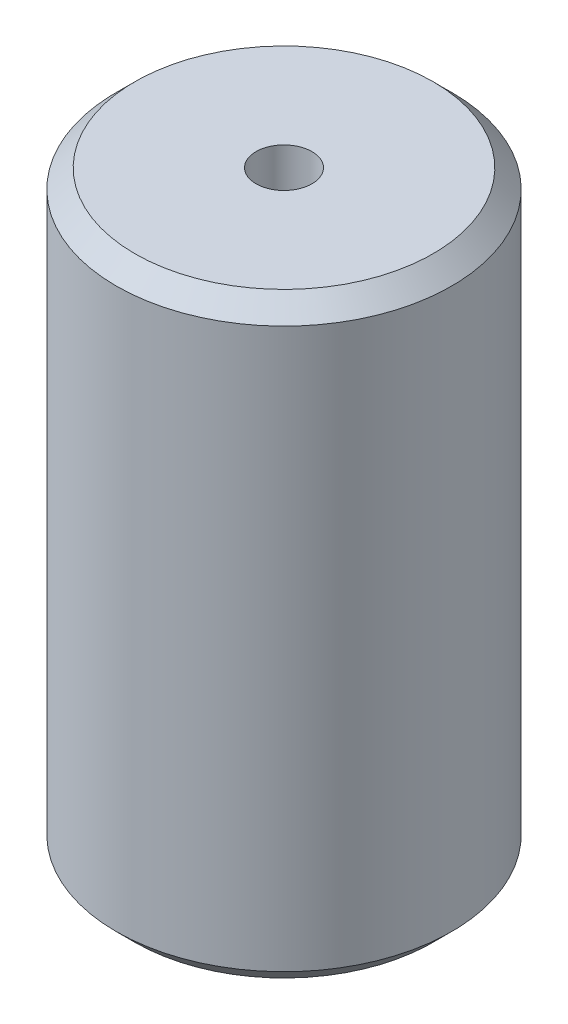
ISO-10303-21;
HEADER;
FILE_DESCRIPTION(('STEP AP214'),'2;1');
FILE_NAME('part.step','',(''),(''),'','','');
FILE_SCHEMA(('AUTOMOTIVE_DESIGN { 1 0 10303 214 1 1 1 1 }'));
ENDSEC;
DATA;
#1=APPLICATION_CONTEXT('core data for automotive mechanical design processes');
#2=APPLICATION_PROTOCOL_DEFINITION('international standard','automotive_design',2000,#1);
#3=PRODUCT_CONTEXT('',#1,'mechanical');
#4=PRODUCT('Part','Part','',(#3));
#5=PRODUCT_RELATED_PRODUCT_CATEGORY('part','',(#4));
#6=PRODUCT_DEFINITION_FORMATION('','',#4);
#7=PRODUCT_DEFINITION_CONTEXT('part definition',#1,'design');
#8=PRODUCT_DEFINITION('design','',#6,#7);
#9=PRODUCT_DEFINITION_SHAPE('','',#8);
#10=(LENGTH_UNIT() NAMED_UNIT(*) SI_UNIT(.MILLI.,.METRE.));
#11=(NAMED_UNIT(*) PLANE_ANGLE_UNIT() SI_UNIT($,.RADIAN.));
#12=(NAMED_UNIT(*) SI_UNIT($,.STERADIAN.) SOLID_ANGLE_UNIT());
#13=UNCERTAINTY_MEASURE_WITH_UNIT(LENGTH_MEASURE(1.E-05),#10,'distance_accuracy_value','');
#14=(GEOMETRIC_REPRESENTATION_CONTEXT(3) GLOBAL_UNCERTAINTY_ASSIGNED_CONTEXT((#13)) GLOBAL_UNIT_ASSIGNED_CONTEXT((#10,
#11,#12)) REPRESENTATION_CONTEXT('',''));
#15=CARTESIAN_POINT('',(0.,0.,0.));
#16=DIRECTION('',(0.,0.,1.));
#17=DIRECTION('',(1.,0.,0.));
#18=AXIS2_PLACEMENT_3D('',#15,#16,#17);
#19=CARTESIAN_POINT('',(0.,32.,0.));
#20=DIRECTION('',(0.,1.,0.));
#21=DIRECTION('',(0.,0.,1.));
#22=AXIS2_PLACEMENT_3D('',#19,#20,#21);
#23=PLANE('',#22);
#24=CARTESIAN_POINT('',(0.,32.,0.));
#25=DIRECTION('',(0.,1.,0.));
#26=DIRECTION('',(0.,0.,1.));
#27=AXIS2_PLACEMENT_3D('',#24,#25,#26);
#28=CIRCLE('',#27,8.);
#29=CARTESIAN_POINT('',(0.,32.,8.));
#30=VERTEX_POINT('',#29);
#31=EDGE_CURVE('E10',#30,#30,#28,.T.);
#32=ORIENTED_EDGE('',*,*,#31,.T.);
#33=EDGE_LOOP('',(#32));
#34=FACE_BOUND('',#33,.T.);
#35=CARTESIAN_POINT('',(0.,32.,0.));
#36=DIRECTION('',(0.,1.,0.));
#37=DIRECTION('',(0.,0.,1.));
#38=AXIS2_PLACEMENT_3D('',#35,#36,#37);
#39=CIRCLE('',#38,1.5);
#40=CARTESIAN_POINT('',(0.,32.,1.5));
#41=VERTEX_POINT('',#40);
#42=EDGE_CURVE('E72',#41,#41,#39,.T.);
#43=ORIENTED_EDGE('',*,*,#42,.F.);
#44=EDGE_LOOP('',(#43));
#45=FACE_BOUND('',#44,.T.);
#46=ADVANCED_FACE('F47',(#34,#45),#23,.T.);
#47=CARTESIAN_POINT('',(0.,0.,0.));
#48=DIRECTION('',(0.,1.,0.));
#49=DIRECTION('',(0.,0.,1.));
#50=AXIS2_PLACEMENT_3D('',#47,#48,#49);
#51=PLANE('',#50);
#52=CARTESIAN_POINT('',(0.,0.,0.));
#53=DIRECTION('',(0.,1.,0.));
#54=DIRECTION('',(0.,0.,1.));
#55=AXIS2_PLACEMENT_3D('',#52,#53,#54);
#56=CIRCLE('',#55,8.);
#57=CARTESIAN_POINT('',(0.,0.,8.));
#58=VERTEX_POINT('',#57);
#59=EDGE_CURVE('E56',#58,#58,#56,.F.);
#60=ORIENTED_EDGE('',*,*,#59,.T.);
#61=EDGE_LOOP('',(#60));
#62=FACE_BOUND('',#61,.T.);
#63=CARTESIAN_POINT('',(0.,0.,0.));
#64=DIRECTION('',(0.,1.,0.));
#65=DIRECTION('',(0.,0.,1.));
#66=AXIS2_PLACEMENT_3D('',#63,#64,#65);
#67=CIRCLE('',#66,1.5);
#68=CARTESIAN_POINT('',(0.,0.,1.5));
#69=VERTEX_POINT('',#68);
#70=EDGE_CURVE('E73',#69,#69,#67,.T.);
#71=ORIENTED_EDGE('',*,*,#70,.T.);
#72=EDGE_LOOP('',(#71));
#73=FACE_BOUND('',#72,.T.);
#74=ADVANCED_FACE('F85',(#62,#73),#51,.F.);
#75=CARTESIAN_POINT('',(0.,32.,0.));
#76=DIRECTION('',(0.,-1.,0.));
#77=DIRECTION('',(0.,0.,-1.));
#78=AXIS2_PLACEMENT_3D('',#75,#76,#77);
#79=CYLINDRICAL_SURFACE('',#78,9.);
#80=CARTESIAN_POINT('',(0.,0.999999999999994,0.));
#81=DIRECTION('',(0.,1.,0.));
#82=DIRECTION('',(0.,0.,1.));
#83=AXIS2_PLACEMENT_3D('',#80,#81,#82);
#84=CIRCLE('',#83,9.);
#85=CARTESIAN_POINT('',(0.,0.999999999999994,9.));
#86=VERTEX_POINT('',#85);
#87=EDGE_CURVE('E61',#86,#86,#84,.T.);
#88=ORIENTED_EDGE('',*,*,#87,.T.);
#89=EDGE_LOOP('',(#88));
#90=FACE_BOUND('',#89,.T.);
#91=CARTESIAN_POINT('',(0.,31.,0.));
#92=DIRECTION('',(0.,1.,0.));
#93=DIRECTION('',(0.,0.,1.));
#94=AXIS2_PLACEMENT_3D('',#91,#92,#93);
#95=CIRCLE('',#94,9.);
#96=CARTESIAN_POINT('',(0.,31.,9.));
#97=VERTEX_POINT('',#96);
#98=EDGE_CURVE('E66',#97,#97,#95,.F.);
#99=ORIENTED_EDGE('',*,*,#98,.T.);
#100=EDGE_LOOP('',(#99));
#101=FACE_BOUND('',#100,.T.);
#102=ADVANCED_FACE('F91',(#90,#101),#79,.T.);
#103=CARTESIAN_POINT('',(0.,32.,0.));
#104=DIRECTION('',(0.,-1.,0.));
#105=DIRECTION('',(0.,0.,-1.));
#106=AXIS2_PLACEMENT_3D('',#103,#104,#105);
#107=CYLINDRICAL_SURFACE('',#106,1.5);
#108=ORIENTED_EDGE('',*,*,#42,.T.);
#109=EDGE_LOOP('',(#108));
#110=FACE_BOUND('',#109,.T.);
#111=ORIENTED_EDGE('',*,*,#70,.F.);
#112=EDGE_LOOP('',(#111));
#113=FACE_BOUND('',#112,.T.);
#114=ADVANCED_FACE('F81',(#110,#113),#107,.F.);
#115=CARTESIAN_POINT('',(0.,0.999999999999994,0.));
#116=DIRECTION('',(0.,1.,0.));
#117=DIRECTION('',(0.,0.,1.));
#118=AXIS2_PLACEMENT_3D('',#115,#116,#117);
#119=CONICAL_SURFACE('',#118,9.,0.785398163397451);
#120=ORIENTED_EDGE('',*,*,#59,.F.);
#121=EDGE_LOOP('',(#120));
#122=FACE_BOUND('',#121,.T.);
#123=ORIENTED_EDGE('',*,*,#87,.F.);
#124=EDGE_LOOP('',(#123));
#125=FACE_BOUND('',#124,.T.);
#126=ADVANCED_FACE('F98',(#122,#125),#119,.T.);
#127=CARTESIAN_POINT('',(0.,32.,0.));
#128=DIRECTION('',(0.,-1.,0.));
#129=DIRECTION('',(0.,0.,-1.));
#130=AXIS2_PLACEMENT_3D('',#127,#128,#129);
#131=CONICAL_SURFACE('',#130,8.,0.785398163397444);
#132=ORIENTED_EDGE('',*,*,#98,.F.);
#133=EDGE_LOOP('',(#132));
#134=FACE_BOUND('',#133,.T.);
#135=ORIENTED_EDGE('',*,*,#31,.F.);
#136=EDGE_LOOP('',(#135));
#137=FACE_BOUND('',#136,.T.);
#138=ADVANCED_FACE('F50',(#134,#137),#131,.T.);
#139=CLOSED_SHELL('',(#46,#74,#102,#114,#126,#138));
#140=MANIFOLD_SOLID_BREP('B2',#139);
#141=ADVANCED_BREP_SHAPE_REPRESENTATION('',(#18,#140),#14);
#142=SHAPE_DEFINITION_REPRESENTATION(#9,#141);
ENDSEC;
END-ISO-10303-21;
